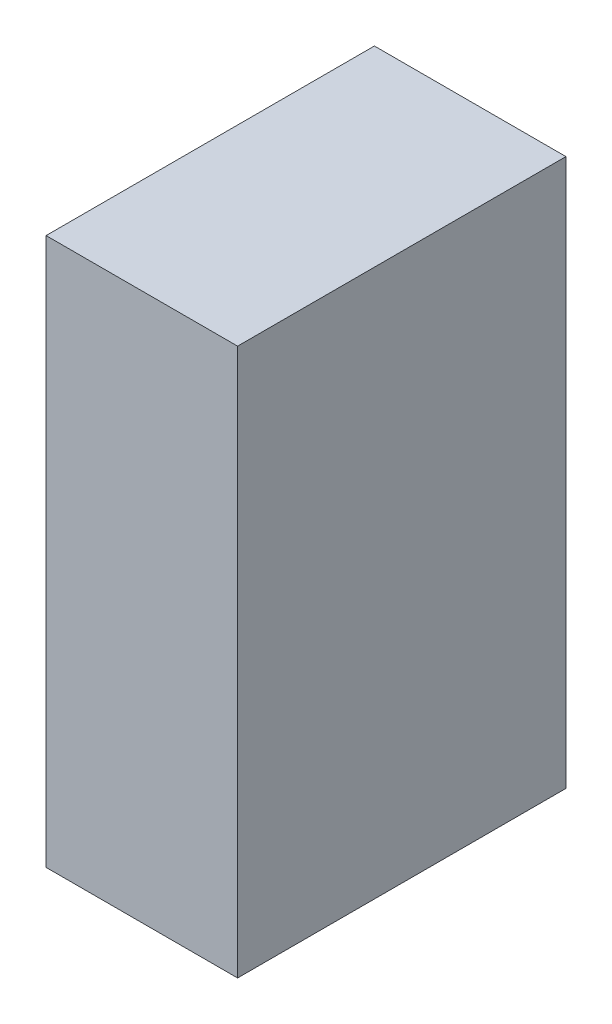
ISO-10303-21;
HEADER;
FILE_DESCRIPTION(('STEP AP214'),'2;1');
FILE_NAME('part.step','',(''),(''),'','','');
FILE_SCHEMA(('AUTOMOTIVE_DESIGN { 1 0 10303 214 1 1 1 1 }'));
ENDSEC;
DATA;
#1=APPLICATION_CONTEXT('core data for automotive mechanical design processes');
#2=APPLICATION_PROTOCOL_DEFINITION('international standard','automotive_design',2000,#1);
#3=PRODUCT_CONTEXT('',#1,'mechanical');
#4=PRODUCT('Part','Part','',(#3));
#5=PRODUCT_RELATED_PRODUCT_CATEGORY('part','',(#4));
#6=PRODUCT_DEFINITION_FORMATION('','',#4);
#7=PRODUCT_DEFINITION_CONTEXT('part definition',#1,'design');
#8=PRODUCT_DEFINITION('design','',#6,#7);
#9=PRODUCT_DEFINITION_SHAPE('','',#8);
#10=(LENGTH_UNIT() NAMED_UNIT(*) SI_UNIT(.MILLI.,.METRE.));
#11=(NAMED_UNIT(*) PLANE_ANGLE_UNIT() SI_UNIT($,.RADIAN.));
#12=(NAMED_UNIT(*) SI_UNIT($,.STERADIAN.) SOLID_ANGLE_UNIT());
#13=UNCERTAINTY_MEASURE_WITH_UNIT(LENGTH_MEASURE(1.E-05),#10,'distance_accuracy_value','');
#14=(GEOMETRIC_REPRESENTATION_CONTEXT(3) GLOBAL_UNCERTAINTY_ASSIGNED_CONTEXT((#13)) GLOBAL_UNIT_ASSIGNED_CONTEXT((#10,
#11,#12)) REPRESENTATION_CONTEXT('',''));
#15=CARTESIAN_POINT('',(0.,0.,0.));
#16=DIRECTION('',(0.,0.,1.));
#17=DIRECTION('',(1.,0.,0.));
#18=AXIS2_PLACEMENT_3D('',#15,#16,#17);
#19=CARTESIAN_POINT('',(520.,180.,-248.));
#20=DIRECTION('',(-1.,0.,0.));
#21=DIRECTION('',(0.,0.,1.));
#22=AXIS2_PLACEMENT_3D('',#19,#20,#21);
#23=PLANE('',#22);
#24=DIRECTION('',(0.,-1.,0.));
#25=VECTOR('',#24,1.);
#26=CARTESIAN_POINT('',(520.,180.,-188.));
#27=LINE('',#26,#25);
#28=CARTESIAN_POINT('',(520.,280.,-188.));
#29=VERTEX_POINT('',#28);
#30=CARTESIAN_POINT('',(520.,180.,-188.));
#31=VERTEX_POINT('',#30);
#32=EDGE_CURVE('E103',#29,#31,#27,.T.);
#33=ORIENTED_EDGE('',*,*,#32,.F.);
#34=DIRECTION('',(0.,0.,1.));
#35=VECTOR('',#34,1.);
#36=CARTESIAN_POINT('',(520.,280.,-248.));
#37=LINE('',#36,#35);
#38=CARTESIAN_POINT('',(520.,280.,-248.));
#39=VERTEX_POINT('',#38);
#40=EDGE_CURVE('E11',#39,#29,#37,.T.);
#41=ORIENTED_EDGE('',*,*,#40,.F.);
#42=DIRECTION('',(0.,-1.,0.));
#43=VECTOR('',#42,1.);
#44=CARTESIAN_POINT('',(520.,180.,-248.));
#45=LINE('',#44,#43);
#46=CARTESIAN_POINT('',(520.,180.,-248.));
#47=VERTEX_POINT('',#46);
#48=EDGE_CURVE('E97',#39,#47,#45,.T.);
#49=ORIENTED_EDGE('',*,*,#48,.T.);
#50=DIRECTION('',(0.,0.,1.));
#51=VECTOR('',#50,1.);
#52=CARTESIAN_POINT('',(520.,180.,-248.));
#53=LINE('',#52,#51);
#54=EDGE_CURVE('E42',#47,#31,#53,.T.);
#55=ORIENTED_EDGE('',*,*,#54,.T.);
#56=EDGE_LOOP('',(#33,#41,#49,#55));
#57=FACE_BOUND('',#56,.T.);
#58=ADVANCED_FACE('F39',(#57),#23,.T.);
#59=CARTESIAN_POINT('',(520.,280.,-248.));
#60=DIRECTION('',(0.,1.,0.));
#61=DIRECTION('',(0.,0.,1.));
#62=AXIS2_PLACEMENT_3D('',#59,#60,#61);
#63=PLANE('',#62);
#64=DIRECTION('',(-1.,0.,0.));
#65=VECTOR('',#64,1.);
#66=CARTESIAN_POINT('',(520.,280.,-188.));
#67=LINE('',#66,#65);
#68=CARTESIAN_POINT('',(555.,280.,-188.));
#69=VERTEX_POINT('',#68);
#70=EDGE_CURVE('E99',#69,#29,#67,.T.);
#71=ORIENTED_EDGE('',*,*,#70,.F.);
#72=DIRECTION('',(0.,0.,1.));
#73=VECTOR('',#72,1.);
#74=CARTESIAN_POINT('',(555.,280.,-248.));
#75=LINE('',#74,#73);
#76=CARTESIAN_POINT('',(555.,280.,-248.));
#77=VERTEX_POINT('',#76);
#78=EDGE_CURVE('E48',#77,#69,#75,.T.);
#79=ORIENTED_EDGE('',*,*,#78,.F.);
#80=DIRECTION('',(-1.,0.,0.));
#81=VECTOR('',#80,1.);
#82=CARTESIAN_POINT('',(520.,280.,-248.));
#83=LINE('',#82,#81);
#84=EDGE_CURVE('E94',#77,#39,#83,.T.);
#85=ORIENTED_EDGE('',*,*,#84,.T.);
#86=ORIENTED_EDGE('',*,*,#40,.T.);
#87=EDGE_LOOP('',(#71,#79,#85,#86));
#88=FACE_BOUND('',#87,.T.);
#89=ADVANCED_FACE('F113',(#88),#63,.T.);
#90=CARTESIAN_POINT('',(555.,180.,-248.));
#91=DIRECTION('',(1.,0.,0.));
#92=DIRECTION('',(0.,0.,-1.));
#93=AXIS2_PLACEMENT_3D('',#90,#91,#92);
#94=PLANE('',#93);
#95=DIRECTION('',(0.,1.,0.));
#96=VECTOR('',#95,1.);
#97=CARTESIAN_POINT('',(555.,180.,-188.));
#98=LINE('',#97,#96);
#99=CARTESIAN_POINT('',(555.,180.,-188.));
#100=VERTEX_POINT('',#99);
#101=EDGE_CURVE('E89',#100,#69,#98,.T.);
#102=ORIENTED_EDGE('',*,*,#101,.F.);
#103=DIRECTION('',(0.,0.,1.));
#104=VECTOR('',#103,1.);
#105=CARTESIAN_POINT('',(555.,180.,-248.));
#106=LINE('',#105,#104);
#107=CARTESIAN_POINT('',(555.,180.,-248.));
#108=VERTEX_POINT('',#107);
#109=EDGE_CURVE('E84',#108,#100,#106,.T.);
#110=ORIENTED_EDGE('',*,*,#109,.F.);
#111=DIRECTION('',(0.,1.,0.));
#112=VECTOR('',#111,1.);
#113=CARTESIAN_POINT('',(555.,180.,-248.));
#114=LINE('',#113,#112);
#115=EDGE_CURVE('E87',#108,#77,#114,.T.);
#116=ORIENTED_EDGE('',*,*,#115,.T.);
#117=ORIENTED_EDGE('',*,*,#78,.T.);
#118=EDGE_LOOP('',(#102,#110,#116,#117));
#119=FACE_BOUND('',#118,.T.);
#120=ADVANCED_FACE('F86',(#119),#94,.T.);
#121=CARTESIAN_POINT('',(520.,180.,-248.));
#122=DIRECTION('',(0.,-1.,0.));
#123=DIRECTION('',(0.,0.,-1.));
#124=AXIS2_PLACEMENT_3D('',#121,#122,#123);
#125=PLANE('',#124);
#126=DIRECTION('',(1.,0.,0.));
#127=VECTOR('',#126,1.);
#128=CARTESIAN_POINT('',(520.,180.,-188.));
#129=LINE('',#128,#127);
#130=EDGE_CURVE('E106',#31,#100,#129,.T.);
#131=ORIENTED_EDGE('',*,*,#130,.F.);
#132=ORIENTED_EDGE('',*,*,#54,.F.);
#133=DIRECTION('',(1.,0.,0.));
#134=VECTOR('',#133,1.);
#135=CARTESIAN_POINT('',(520.,180.,-248.));
#136=LINE('',#135,#134);
#137=EDGE_CURVE('E93',#47,#108,#136,.T.);
#138=ORIENTED_EDGE('',*,*,#137,.T.);
#139=ORIENTED_EDGE('',*,*,#109,.T.);
#140=EDGE_LOOP('',(#131,#132,#138,#139));
#141=FACE_BOUND('',#140,.T.);
#142=ADVANCED_FACE('F96',(#141),#125,.T.);
#143=CARTESIAN_POINT('',(0.,0.,-248.));
#144=DIRECTION('',(0.,0.,-1.));
#145=DIRECTION('',(-1.,0.,0.));
#146=AXIS2_PLACEMENT_3D('',#143,#144,#145);
#147=PLANE('',#146);
#148=ORIENTED_EDGE('',*,*,#48,.F.);
#149=ORIENTED_EDGE('',*,*,#84,.F.);
#150=ORIENTED_EDGE('',*,*,#115,.F.);
#151=ORIENTED_EDGE('',*,*,#137,.F.);
#152=EDGE_LOOP('',(#148,#149,#150,#151));
#153=FACE_BOUND('',#152,.T.);
#154=ADVANCED_FACE('F92',(#153),#147,.T.);
#155=CARTESIAN_POINT('',(0.,0.,-188.));
#156=DIRECTION('',(0.,0.,-1.));
#157=DIRECTION('',(-1.,0.,0.));
#158=AXIS2_PLACEMENT_3D('',#155,#156,#157);
#159=PLANE('',#158);
#160=ORIENTED_EDGE('',*,*,#32,.T.);
#161=ORIENTED_EDGE('',*,*,#130,.T.);
#162=ORIENTED_EDGE('',*,*,#101,.T.);
#163=ORIENTED_EDGE('',*,*,#70,.T.);
#164=EDGE_LOOP('',(#160,#161,#162,#163));
#165=FACE_BOUND('',#164,.T.);
#166=ADVANCED_FACE('F112',(#165),#159,.F.);
#167=CLOSED_SHELL('',(#58,#89,#120,#142,#154,#166));
#168=MANIFOLD_SOLID_BREP('B2',#167);
#169=ADVANCED_BREP_SHAPE_REPRESENTATION('',(#18,#168),#14);
#170=SHAPE_DEFINITION_REPRESENTATION(#9,#169);
ENDSEC;
END-ISO-10303-21;
